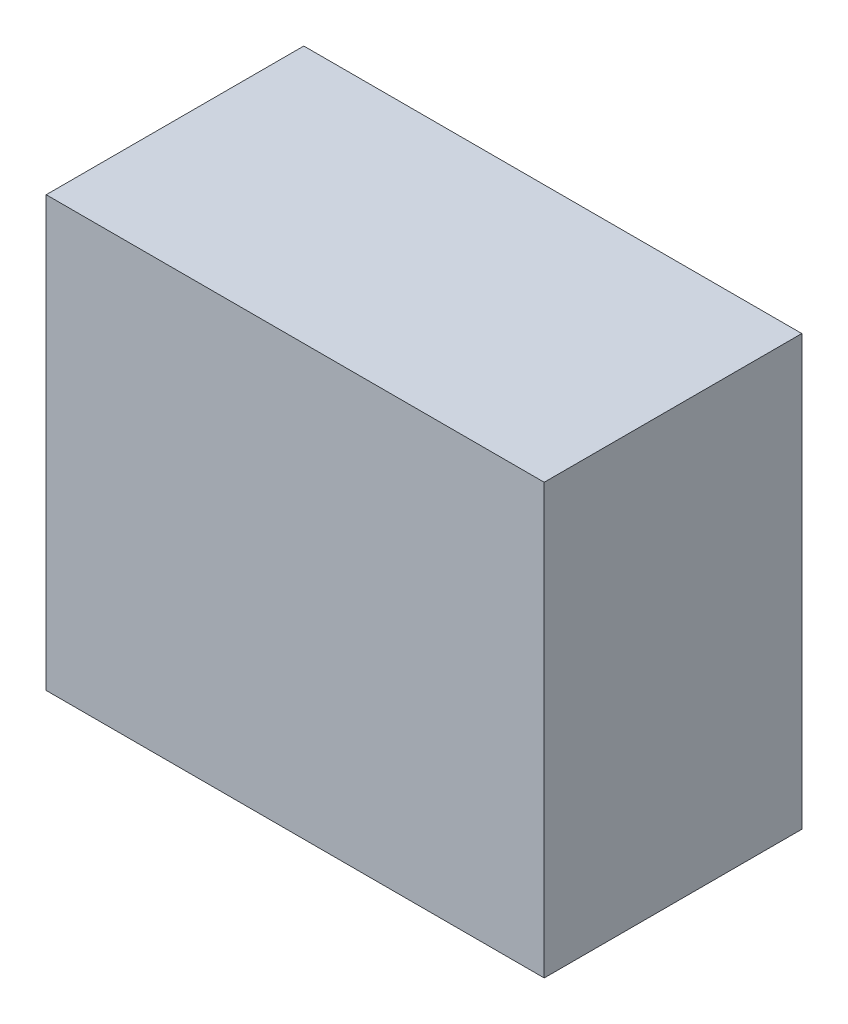
ISO-10303-21;
HEADER;
FILE_DESCRIPTION(('STEP AP214'),'2;1');
FILE_NAME('part.step','',(''),(''),'','','');
FILE_SCHEMA(('AUTOMOTIVE_DESIGN { 1 0 10303 214 1 1 1 1 }'));
ENDSEC;
DATA;
#1=APPLICATION_CONTEXT('core data for automotive mechanical design processes');
#2=APPLICATION_PROTOCOL_DEFINITION('international standard','automotive_design',2000,#1);
#3=PRODUCT_CONTEXT('',#1,'mechanical');
#4=PRODUCT('Part','Part','',(#3));
#5=PRODUCT_RELATED_PRODUCT_CATEGORY('part','',(#4));
#6=PRODUCT_DEFINITION_FORMATION('','',#4);
#7=PRODUCT_DEFINITION_CONTEXT('part definition',#1,'design');
#8=PRODUCT_DEFINITION('design','',#6,#7);
#9=PRODUCT_DEFINITION_SHAPE('','',#8);
#10=(LENGTH_UNIT() NAMED_UNIT(*) SI_UNIT(.MILLI.,.METRE.));
#11=(NAMED_UNIT(*) PLANE_ANGLE_UNIT() SI_UNIT($,.RADIAN.));
#12=(NAMED_UNIT(*) SI_UNIT($,.STERADIAN.) SOLID_ANGLE_UNIT());
#13=UNCERTAINTY_MEASURE_WITH_UNIT(LENGTH_MEASURE(1.E-05),#10,'distance_accuracy_value','');
#14=(GEOMETRIC_REPRESENTATION_CONTEXT(3) GLOBAL_UNCERTAINTY_ASSIGNED_CONTEXT((#13)) GLOBAL_UNIT_ASSIGNED_CONTEXT((#10,
#11,#12)) REPRESENTATION_CONTEXT('',''));
#15=CARTESIAN_POINT('',(0.,0.,0.));
#16=DIRECTION('',(0.,0.,1.));
#17=DIRECTION('',(1.,0.,0.));
#18=AXIS2_PLACEMENT_3D('',#15,#16,#17);
#19=CARTESIAN_POINT('',(0.,0.,15.24));
#20=DIRECTION('',(1.,0.,0.));
#21=DIRECTION('',(0.,0.,-1.));
#22=AXIS2_PLACEMENT_3D('',#19,#20,#21);
#23=PLANE('',#22);
#24=DIRECTION('',(0.,-1.,0.));
#25=VECTOR('',#24,1.);
#26=CARTESIAN_POINT('',(0.,0.,0.));
#27=LINE('',#26,#25);
#28=CARTESIAN_POINT('',(0.,25.4,0.));
#29=VERTEX_POINT('',#28);
#30=CARTESIAN_POINT('',(0.,0.,0.));
#31=VERTEX_POINT('',#30);
#32=EDGE_CURVE('E141',#29,#31,#27,.T.);
#33=ORIENTED_EDGE('',*,*,#32,.T.);
#34=DIRECTION('',(0.,0.,-1.));
#35=VECTOR('',#34,1.);
#36=CARTESIAN_POINT('',(0.,0.,15.24));
#37=LINE('',#36,#35);
#38=CARTESIAN_POINT('',(0.,0.,15.24));
#39=VERTEX_POINT('',#38);
#40=EDGE_CURVE('E11',#39,#31,#37,.T.);
#41=ORIENTED_EDGE('',*,*,#40,.F.);
#42=DIRECTION('',(0.,-1.,0.));
#43=VECTOR('',#42,1.);
#44=CARTESIAN_POINT('',(0.,0.,15.24));
#45=LINE('',#44,#43);
#46=CARTESIAN_POINT('',(0.,25.4,15.24));
#47=VERTEX_POINT('',#46);
#48=EDGE_CURVE('E145',#47,#39,#45,.T.);
#49=ORIENTED_EDGE('',*,*,#48,.F.);
#50=DIRECTION('',(0.,0.,-1.));
#51=VECTOR('',#50,1.);
#52=CARTESIAN_POINT('',(0.,25.4,15.24));
#53=LINE('',#52,#51);
#54=EDGE_CURVE('E151',#47,#29,#53,.T.);
#55=ORIENTED_EDGE('',*,*,#54,.T.);
#56=EDGE_LOOP('',(#33,#41,#49,#55));
#57=FACE_BOUND('',#56,.T.);
#58=ADVANCED_FACE('F33',(#57),#23,.F.);
#59=CARTESIAN_POINT('',(0.,0.,15.24));
#60=DIRECTION('',(0.,1.,0.));
#61=DIRECTION('',(0.,0.,1.));
#62=AXIS2_PLACEMENT_3D('',#59,#60,#61);
#63=PLANE('',#62);
#64=DIRECTION('',(1.,0.,0.));
#65=VECTOR('',#64,1.);
#66=CARTESIAN_POINT('',(4.62280000000001,0.,1.905));
#67=LINE('',#66,#65);
#68=CARTESIAN_POINT('',(4.62280000000001,0.,1.905));
#69=VERTEX_POINT('',#68);
#70=CARTESIAN_POINT('',(24.765,0.,1.905));
#71=VERTEX_POINT('',#70);
#72=EDGE_CURVE('E135',#69,#71,#67,.T.);
#73=ORIENTED_EDGE('',*,*,#72,.F.);
#74=DIRECTION('',(0.,0.,-1.));
#75=VECTOR('',#74,1.);
#76=CARTESIAN_POINT('',(4.62280000000001,0.,13.335));
#77=LINE('',#76,#75);
#78=CARTESIAN_POINT('',(4.62280000000001,0.,13.335));
#79=VERTEX_POINT('',#78);
#80=EDGE_CURVE('E47',#79,#69,#77,.T.);
#81=ORIENTED_EDGE('',*,*,#80,.F.);
#82=DIRECTION('',(-1.,0.,0.));
#83=VECTOR('',#82,1.);
#84=CARTESIAN_POINT('',(4.62280000000001,0.,13.335));
#85=LINE('',#84,#83);
#86=CARTESIAN_POINT('',(24.765,0.,13.335));
#87=VERTEX_POINT('',#86);
#88=EDGE_CURVE('E126',#87,#79,#85,.T.);
#89=ORIENTED_EDGE('',*,*,#88,.F.);
#90=DIRECTION('',(0.,0.,1.));
#91=VECTOR('',#90,1.);
#92=CARTESIAN_POINT('',(24.765,0.,13.335));
#93=LINE('',#92,#91);
#94=EDGE_CURVE('E129',#71,#87,#93,.T.);
#95=ORIENTED_EDGE('',*,*,#94,.F.);
#96=EDGE_LOOP('',(#73,#81,#89,#95));
#97=FACE_BOUND('',#96,.T.);
#98=DIRECTION('',(1.,0.,0.));
#99=VECTOR('',#98,1.);
#100=CARTESIAN_POINT('',(0.,0.,0.));
#101=LINE('',#100,#99);
#102=CARTESIAN_POINT('',(29.464,0.,0.));
#103=VERTEX_POINT('',#102);
#104=EDGE_CURVE('E154',#31,#103,#101,.T.);
#105=ORIENTED_EDGE('',*,*,#104,.T.);
#106=DIRECTION('',(0.,0.,-1.));
#107=VECTOR('',#106,1.);
#108=CARTESIAN_POINT('',(29.464,0.,15.24));
#109=LINE('',#108,#107);
#110=CARTESIAN_POINT('',(29.464,0.,15.24));
#111=VERTEX_POINT('',#110);
#112=EDGE_CURVE('E40',#111,#103,#109,.T.);
#113=ORIENTED_EDGE('',*,*,#112,.F.);
#114=DIRECTION('',(1.,0.,0.));
#115=VECTOR('',#114,1.);
#116=CARTESIAN_POINT('',(0.,0.,15.24));
#117=LINE('',#116,#115);
#118=EDGE_CURVE('E84',#39,#111,#117,.T.);
#119=ORIENTED_EDGE('',*,*,#118,.F.);
#120=ORIENTED_EDGE('',*,*,#40,.T.);
#121=EDGE_LOOP('',(#105,#113,#119,#120));
#122=FACE_BOUND('',#121,.T.);
#123=ADVANCED_FACE('F182',(#97,#122),#63,.F.);
#124=CARTESIAN_POINT('',(29.464,0.,15.24));
#125=DIRECTION('',(-1.,0.,0.));
#126=DIRECTION('',(0.,0.,1.));
#127=AXIS2_PLACEMENT_3D('',#124,#125,#126);
#128=PLANE('',#127);
#129=DIRECTION('',(0.,1.,0.));
#130=VECTOR('',#129,1.);
#131=CARTESIAN_POINT('',(29.464,0.,0.));
#132=LINE('',#131,#130);
#133=CARTESIAN_POINT('',(29.464,25.4,0.));
#134=VERTEX_POINT('',#133);
#135=EDGE_CURVE('E156',#103,#134,#132,.T.);
#136=ORIENTED_EDGE('',*,*,#135,.T.);
#137=DIRECTION('',(0.,0.,-1.));
#138=VECTOR('',#137,1.);
#139=CARTESIAN_POINT('',(29.464,25.4,15.24));
#140=LINE('',#139,#138);
#141=CARTESIAN_POINT('',(29.464,25.4,15.24));
#142=VERTEX_POINT('',#141);
#143=EDGE_CURVE('E160',#142,#134,#140,.T.);
#144=ORIENTED_EDGE('',*,*,#143,.F.);
#145=DIRECTION('',(0.,1.,0.));
#146=VECTOR('',#145,1.);
#147=CARTESIAN_POINT('',(29.464,0.,15.24));
#148=LINE('',#147,#146);
#149=EDGE_CURVE('E148',#111,#142,#148,.T.);
#150=ORIENTED_EDGE('',*,*,#149,.F.);
#151=ORIENTED_EDGE('',*,*,#112,.T.);
#152=EDGE_LOOP('',(#136,#144,#150,#151));
#153=FACE_BOUND('',#152,.T.);
#154=ADVANCED_FACE('F165',(#153),#128,.F.);
#155=CARTESIAN_POINT('',(0.,25.4,15.24));
#156=DIRECTION('',(0.,-1.,0.));
#157=DIRECTION('',(0.,0.,-1.));
#158=AXIS2_PLACEMENT_3D('',#155,#156,#157);
#159=PLANE('',#158);
#160=DIRECTION('',(-1.,0.,0.));
#161=VECTOR('',#160,1.);
#162=CARTESIAN_POINT('',(0.,25.4,0.));
#163=LINE('',#162,#161);
#164=EDGE_CURVE('E77',#134,#29,#163,.T.);
#165=ORIENTED_EDGE('',*,*,#164,.T.);
#166=ORIENTED_EDGE('',*,*,#54,.F.);
#167=DIRECTION('',(-1.,0.,0.));
#168=VECTOR('',#167,1.);
#169=CARTESIAN_POINT('',(0.,25.4,15.24));
#170=LINE('',#169,#168);
#171=EDGE_CURVE('E56',#142,#47,#170,.T.);
#172=ORIENTED_EDGE('',*,*,#171,.F.);
#173=ORIENTED_EDGE('',*,*,#143,.T.);
#174=EDGE_LOOP('',(#165,#166,#172,#173));
#175=FACE_BOUND('',#174,.T.);
#176=ADVANCED_FACE('F173',(#175),#159,.F.);
#177=CARTESIAN_POINT('',(0.,0.,15.24));
#178=DIRECTION('',(0.,0.,-1.));
#179=DIRECTION('',(-1.,0.,0.));
#180=AXIS2_PLACEMENT_3D('',#177,#178,#179);
#181=PLANE('',#180);
#182=ORIENTED_EDGE('',*,*,#48,.T.);
#183=ORIENTED_EDGE('',*,*,#118,.T.);
#184=ORIENTED_EDGE('',*,*,#149,.T.);
#185=ORIENTED_EDGE('',*,*,#171,.T.);
#186=EDGE_LOOP('',(#182,#183,#184,#185));
#187=FACE_BOUND('',#186,.T.);
#188=ADVANCED_FACE('F175',(#187),#181,.F.);
#189=CARTESIAN_POINT('',(0.,0.,0.));
#190=DIRECTION('',(0.,0.,-1.));
#191=DIRECTION('',(-1.,0.,0.));
#192=AXIS2_PLACEMENT_3D('',#189,#190,#191);
#193=PLANE('',#192);
#194=ORIENTED_EDGE('',*,*,#32,.F.);
#195=ORIENTED_EDGE('',*,*,#164,.F.);
#196=ORIENTED_EDGE('',*,*,#135,.F.);
#197=ORIENTED_EDGE('',*,*,#104,.F.);
#198=EDGE_LOOP('',(#194,#195,#196,#197));
#199=FACE_BOUND('',#198,.T.);
#200=ADVANCED_FACE('F169',(#199),#193,.T.);
#201=CARTESIAN_POINT('',(4.62280000000001,22.86,13.335));
#202=DIRECTION('',(-1.,0.,0.));
#203=DIRECTION('',(0.,0.,1.));
#204=AXIS2_PLACEMENT_3D('',#201,#202,#203);
#205=PLANE('',#204);
#206=ORIENTED_EDGE('',*,*,#80,.T.);
#207=DIRECTION('',(0.,-1.,0.));
#208=VECTOR('',#207,1.);
#209=CARTESIAN_POINT('',(4.62280000000001,22.86,1.905));
#210=LINE('',#209,#208);
#211=CARTESIAN_POINT('',(4.62280000000001,22.86,1.905));
#212=VERTEX_POINT('',#211);
#213=EDGE_CURVE('E104',#212,#69,#210,.T.);
#214=ORIENTED_EDGE('',*,*,#213,.F.);
#215=DIRECTION('',(0.,0.,-1.));
#216=VECTOR('',#215,1.);
#217=CARTESIAN_POINT('',(4.62280000000001,22.86,13.335));
#218=LINE('',#217,#216);
#219=CARTESIAN_POINT('',(4.62280000000001,22.86,13.335));
#220=VERTEX_POINT('',#219);
#221=EDGE_CURVE('E108',#220,#212,#218,.T.);
#222=ORIENTED_EDGE('',*,*,#221,.F.);
#223=DIRECTION('',(0.,-1.,0.));
#224=VECTOR('',#223,1.);
#225=CARTESIAN_POINT('',(4.62280000000001,22.86,13.335));
#226=LINE('',#225,#224);
#227=EDGE_CURVE('E139',#220,#79,#226,.T.);
#228=ORIENTED_EDGE('',*,*,#227,.T.);
#229=EDGE_LOOP('',(#206,#214,#222,#228));
#230=FACE_BOUND('',#229,.T.);
#231=ADVANCED_FACE('F106',(#230),#205,.F.);
#232=CARTESIAN_POINT('',(4.62280000000001,22.86,13.335));
#233=DIRECTION('',(0.,0.,1.));
#234=DIRECTION('',(1.,0.,0.));
#235=AXIS2_PLACEMENT_3D('',#232,#233,#234);
#236=PLANE('',#235);
#237=ORIENTED_EDGE('',*,*,#88,.T.);
#238=ORIENTED_EDGE('',*,*,#227,.F.);
#239=DIRECTION('',(-1.,0.,0.));
#240=VECTOR('',#239,1.);
#241=CARTESIAN_POINT('',(4.62280000000001,22.86,13.335));
#242=LINE('',#241,#240);
#243=CARTESIAN_POINT('',(24.765,22.86,13.335));
#244=VERTEX_POINT('',#243);
#245=EDGE_CURVE('E114',#244,#220,#242,.T.);
#246=ORIENTED_EDGE('',*,*,#245,.F.);
#247=DIRECTION('',(0.,-1.,0.));
#248=VECTOR('',#247,1.);
#249=CARTESIAN_POINT('',(24.765,22.86,13.335));
#250=LINE('',#249,#248);
#251=EDGE_CURVE('E142',#244,#87,#250,.T.);
#252=ORIENTED_EDGE('',*,*,#251,.T.);
#253=EDGE_LOOP('',(#237,#238,#246,#252));
#254=FACE_BOUND('',#253,.T.);
#255=ADVANCED_FACE('F197',(#254),#236,.F.);
#256=CARTESIAN_POINT('',(24.765,22.86,13.335));
#257=DIRECTION('',(1.,0.,0.));
#258=DIRECTION('',(0.,0.,-1.));
#259=AXIS2_PLACEMENT_3D('',#256,#257,#258);
#260=PLANE('',#259);
#261=ORIENTED_EDGE('',*,*,#94,.T.);
#262=ORIENTED_EDGE('',*,*,#251,.F.);
#263=DIRECTION('',(0.,0.,1.));
#264=VECTOR('',#263,1.);
#265=CARTESIAN_POINT('',(24.765,22.86,13.335));
#266=LINE('',#265,#264);
#267=CARTESIAN_POINT('',(24.765,22.86,1.905));
#268=VERTEX_POINT('',#267);
#269=EDGE_CURVE('E122',#268,#244,#266,.T.);
#270=ORIENTED_EDGE('',*,*,#269,.F.);
#271=DIRECTION('',(0.,-1.,0.));
#272=VECTOR('',#271,1.);
#273=CARTESIAN_POINT('',(24.765,22.86,1.905));
#274=LINE('',#273,#272);
#275=EDGE_CURVE('E113',#268,#71,#274,.T.);
#276=ORIENTED_EDGE('',*,*,#275,.T.);
#277=EDGE_LOOP('',(#261,#262,#270,#276));
#278=FACE_BOUND('',#277,.T.);
#279=ADVANCED_FACE('F195',(#278),#260,.F.);
#280=CARTESIAN_POINT('',(4.62280000000001,22.86,1.905));
#281=DIRECTION('',(0.,0.,-1.));
#282=DIRECTION('',(-1.,0.,0.));
#283=AXIS2_PLACEMENT_3D('',#280,#281,#282);
#284=PLANE('',#283);
#285=ORIENTED_EDGE('',*,*,#72,.T.);
#286=ORIENTED_EDGE('',*,*,#275,.F.);
#287=DIRECTION('',(1.,0.,0.));
#288=VECTOR('',#287,1.);
#289=CARTESIAN_POINT('',(4.62280000000001,22.86,1.905));
#290=LINE('',#289,#288);
#291=EDGE_CURVE('E117',#212,#268,#290,.T.);
#292=ORIENTED_EDGE('',*,*,#291,.F.);
#293=ORIENTED_EDGE('',*,*,#213,.T.);
#294=EDGE_LOOP('',(#285,#286,#292,#293));
#295=FACE_BOUND('',#294,.T.);
#296=ADVANCED_FACE('F118',(#295),#284,.F.);
#297=CARTESIAN_POINT('',(0.,22.86,0.));
#298=DIRECTION('',(0.,-1.,0.));
#299=DIRECTION('',(0.,0.,-1.));
#300=AXIS2_PLACEMENT_3D('',#297,#298,#299);
#301=PLANE('',#300);
#302=ORIENTED_EDGE('',*,*,#221,.T.);
#303=ORIENTED_EDGE('',*,*,#291,.T.);
#304=ORIENTED_EDGE('',*,*,#269,.T.);
#305=ORIENTED_EDGE('',*,*,#245,.T.);
#306=EDGE_LOOP('',(#302,#303,#304,#305));
#307=FACE_BOUND('',#306,.T.);
#308=ADVANCED_FACE('F124',(#307),#301,.T.);
#309=CLOSED_SHELL('',(#58,#123,#154,#176,#188,#200,#231,#255,#279,#296,#308));
#310=MANIFOLD_SOLID_BREP('B2',#309);
#311=ADVANCED_BREP_SHAPE_REPRESENTATION('',(#18,#310),#14);
#312=SHAPE_DEFINITION_REPRESENTATION(#9,#311);
ENDSEC;
END-ISO-10303-21;
